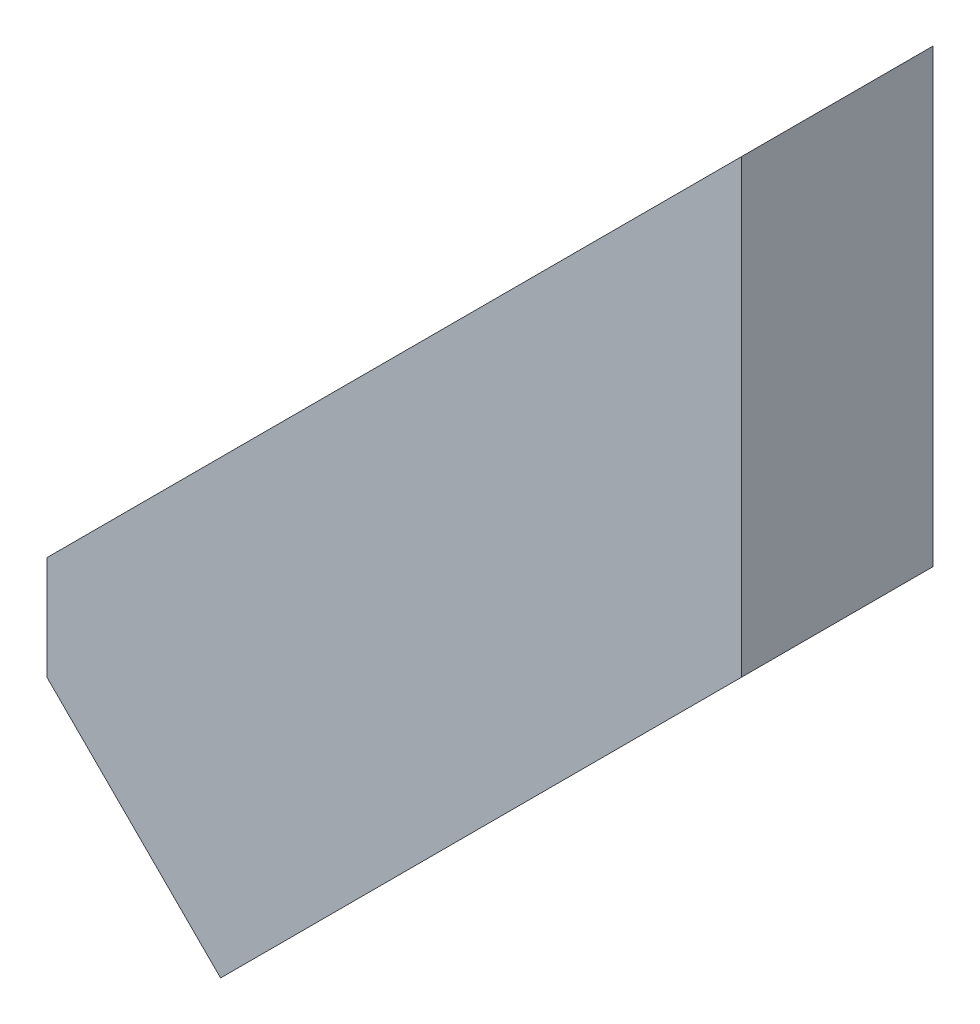
ISO-10303-21;
HEADER;
FILE_DESCRIPTION(('STEP AP214'),'2;1');
FILE_NAME('part.step','',(''),(''),'','','');
FILE_SCHEMA(('AUTOMOTIVE_DESIGN { 1 0 10303 214 1 1 1 1 }'));
ENDSEC;
DATA;
#1=APPLICATION_CONTEXT('core data for automotive mechanical design processes');
#2=APPLICATION_PROTOCOL_DEFINITION('international standard','automotive_design',2000,#1);
#3=PRODUCT_CONTEXT('',#1,'mechanical');
#4=PRODUCT('Part','Part','',(#3));
#5=PRODUCT_RELATED_PRODUCT_CATEGORY('part','',(#4));
#6=PRODUCT_DEFINITION_FORMATION('','',#4);
#7=PRODUCT_DEFINITION_CONTEXT('part definition',#1,'design');
#8=PRODUCT_DEFINITION('design','',#6,#7);
#9=PRODUCT_DEFINITION_SHAPE('','',#8);
#10=(LENGTH_UNIT() NAMED_UNIT(*) SI_UNIT(.MILLI.,.METRE.));
#11=(NAMED_UNIT(*) PLANE_ANGLE_UNIT() SI_UNIT($,.RADIAN.));
#12=(NAMED_UNIT(*) SI_UNIT($,.STERADIAN.) SOLID_ANGLE_UNIT());
#13=UNCERTAINTY_MEASURE_WITH_UNIT(LENGTH_MEASURE(1.E-05),#10,'distance_accuracy_value','');
#14=(GEOMETRIC_REPRESENTATION_CONTEXT(3) GLOBAL_UNCERTAINTY_ASSIGNED_CONTEXT((#13)) GLOBAL_UNIT_ASSIGNED_CONTEXT((#10,
#11,#12)) REPRESENTATION_CONTEXT('',''));
#15=CARTESIAN_POINT('',(0.,0.,0.));
#16=DIRECTION('',(0.,0.,1.));
#17=DIRECTION('',(1.,0.,0.));
#18=AXIS2_PLACEMENT_3D('',#15,#16,#17);
#19=CARTESIAN_POINT('',(1.27016256,0.12832334,0.));
#20=DIRECTION('',(0.707106781186548,-0.707106781186548,0.));
#21=DIRECTION('',(0.,0.,-1.));
#22=AXIS2_PLACEMENT_3D('',#19,#20,#21);
#23=PLANE('',#22);
#24=DIRECTION('',(0.,0.,1.));
#25=VECTOR('',#24,1.);
#26=CARTESIAN_POINT('',(1.27016256,0.12832334,0.));
#27=LINE('',#26,#25);
#28=CARTESIAN_POINT('',(1.27016256,0.12832334,0.));
#29=VERTEX_POINT('',#28);
#30=CARTESIAN_POINT('',(1.27016256,0.12832334,0.6999986));
#31=VERTEX_POINT('',#30);
#32=EDGE_CURVE('E11',#29,#31,#27,.T.);
#33=ORIENTED_EDGE('',*,*,#32,.T.);
#34=DIRECTION('',(-0.707106781186548,-0.707106781186548,0.));
#35=VECTOR('',#34,1.);
#36=CARTESIAN_POINT('',(1.27016256,0.12832334,0.6999986));
#37=LINE('',#36,#35);
#38=CARTESIAN_POINT('',(-0.63516002,-1.77699924,0.6999986));
#39=VERTEX_POINT('',#38);
#40=EDGE_CURVE('E27',#31,#39,#37,.T.);
#41=ORIENTED_EDGE('',*,*,#40,.T.);
#42=DIRECTION('',(0.,0.,1.));
#43=VECTOR('',#42,1.);
#44=CARTESIAN_POINT('',(-0.63516002,-1.77699924,0.));
#45=LINE('',#44,#43);
#46=CARTESIAN_POINT('',(-0.63516002,-1.77699924,0.));
#47=VERTEX_POINT('',#46);
#48=EDGE_CURVE('E51',#47,#39,#45,.T.);
#49=ORIENTED_EDGE('',*,*,#48,.F.);
#50=DIRECTION('',(-0.707106781186548,-0.707106781186548,0.));
#51=VECTOR('',#50,1.);
#52=CARTESIAN_POINT('',(1.27016256,0.12832334,0.));
#53=LINE('',#52,#51);
#54=EDGE_CURVE('E103',#29,#47,#53,.T.);
#55=ORIENTED_EDGE('',*,*,#54,.F.);
#56=EDGE_LOOP('',(#33,#41,#49,#55));
#57=FACE_BOUND('',#56,.T.);
#58=ADVANCED_FACE('F17',(#57),#23,.T.);
#59=CARTESIAN_POINT('',(-0.63516002,-1.77699924,0.));
#60=DIRECTION('',(-0.707106781186548,-0.707106781186548,0.));
#61=DIRECTION('',(-0.707106781186548,0.707106781186548,0.));
#62=AXIS2_PLACEMENT_3D('',#59,#60,#61);
#63=PLANE('',#62);
#64=ORIENTED_EDGE('',*,*,#48,.T.);
#65=DIRECTION('',(-0.707106781186548,0.707106781186548,0.));
#66=VECTOR('',#65,1.);
#67=CARTESIAN_POINT('',(-0.63516002,-1.77699924,0.6999986));
#68=LINE('',#67,#66);
#69=CARTESIAN_POINT('',(-1.27016002,-1.14199924,0.6999986));
#70=VERTEX_POINT('',#69);
#71=EDGE_CURVE('E119',#39,#70,#68,.T.);
#72=ORIENTED_EDGE('',*,*,#71,.T.);
#73=DIRECTION('',(0.,0.,1.));
#74=VECTOR('',#73,1.);
#75=CARTESIAN_POINT('',(-1.27016002,-1.14199924,0.));
#76=LINE('',#75,#74);
#77=CARTESIAN_POINT('',(-1.27016002,-1.14199924,0.));
#78=VERTEX_POINT('',#77);
#79=EDGE_CURVE('E116',#78,#70,#76,.T.);
#80=ORIENTED_EDGE('',*,*,#79,.F.);
#81=DIRECTION('',(-0.707106781186548,0.707106781186548,0.));
#82=VECTOR('',#81,1.);
#83=CARTESIAN_POINT('',(-0.63516002,-1.77699924,0.));
#84=LINE('',#83,#82);
#85=EDGE_CURVE('E109',#47,#78,#84,.T.);
#86=ORIENTED_EDGE('',*,*,#85,.F.);
#87=EDGE_LOOP('',(#64,#72,#80,#86));
#88=FACE_BOUND('',#87,.T.);
#89=ADVANCED_FACE('F141',(#88),#63,.T.);
#90=CARTESIAN_POINT('',(-1.27016002,-1.14199924,0.));
#91=DIRECTION('',(-1.,0.,0.));
#92=DIRECTION('',(0.,0.,1.));
#93=AXIS2_PLACEMENT_3D('',#90,#91,#92);
#94=PLANE('',#93);
#95=ORIENTED_EDGE('',*,*,#79,.T.);
#96=DIRECTION('',(0.,1.,0.));
#97=VECTOR('',#96,1.);
#98=CARTESIAN_POINT('',(-1.27016002,-1.14199924,0.6999986));
#99=LINE('',#98,#97);
#100=CARTESIAN_POINT('',(-1.27016002,-0.7633208,0.6999986));
#101=VERTEX_POINT('',#100);
#102=EDGE_CURVE('E113',#70,#101,#99,.T.);
#103=ORIENTED_EDGE('',*,*,#102,.T.);
#104=DIRECTION('',(0.,0.,1.));
#105=VECTOR('',#104,1.);
#106=CARTESIAN_POINT('',(-1.27016002,-0.7633208,0.));
#107=LINE('',#106,#105);
#108=CARTESIAN_POINT('',(-1.27016002,-0.7633208,0.));
#109=VERTEX_POINT('',#108);
#110=EDGE_CURVE('E21',#109,#101,#107,.T.);
#111=ORIENTED_EDGE('',*,*,#110,.F.);
#112=DIRECTION('',(0.,1.,0.));
#113=VECTOR('',#112,1.);
#114=CARTESIAN_POINT('',(-1.27016002,-1.14199924,0.));
#115=LINE('',#114,#113);
#116=EDGE_CURVE('E115',#78,#109,#115,.T.);
#117=ORIENTED_EDGE('',*,*,#116,.F.);
#118=EDGE_LOOP('',(#95,#103,#111,#117));
#119=FACE_BOUND('',#118,.T.);
#120=ADVANCED_FACE('F144',(#119),#94,.T.);
#121=CARTESIAN_POINT('',(-1.27016002,-0.7633208,0.));
#122=DIRECTION('',(-0.707106781186548,0.707106781186548,0.));
#123=DIRECTION('',(0.,0.,1.));
#124=AXIS2_PLACEMENT_3D('',#121,#122,#123);
#125=PLANE('',#124);
#126=ORIENTED_EDGE('',*,*,#110,.T.);
#127=DIRECTION('',(0.707106781186548,0.707106781186548,0.));
#128=VECTOR('',#127,1.);
#129=CARTESIAN_POINT('',(-1.27016002,-0.7633208,0.6999986));
#130=LINE('',#129,#128);
#131=CARTESIAN_POINT('',(1.27016256,1.77700178,0.6999986));
#132=VERTEX_POINT('',#131);
#133=EDGE_CURVE('E91',#101,#132,#130,.T.);
#134=ORIENTED_EDGE('',*,*,#133,.T.);
#135=DIRECTION('',(0.,0.,1.));
#136=VECTOR('',#135,1.);
#137=CARTESIAN_POINT('',(1.27016256,1.77700178,0.));
#138=LINE('',#137,#136);
#139=CARTESIAN_POINT('',(1.27016256,1.77700178,0.));
#140=VERTEX_POINT('',#139);
#141=EDGE_CURVE('E81',#140,#132,#138,.T.);
#142=ORIENTED_EDGE('',*,*,#141,.F.);
#143=DIRECTION('',(0.707106781186548,0.707106781186548,0.));
#144=VECTOR('',#143,1.);
#145=CARTESIAN_POINT('',(-1.27016002,-0.7633208,0.));
#146=LINE('',#145,#144);
#147=EDGE_CURVE('E121',#109,#140,#146,.T.);
#148=ORIENTED_EDGE('',*,*,#147,.F.);
#149=EDGE_LOOP('',(#126,#134,#142,#148));
#150=FACE_BOUND('',#149,.T.);
#151=ADVANCED_FACE('F95',(#150),#125,.T.);
#152=CARTESIAN_POINT('',(1.27016256,1.77700178,0.));
#153=DIRECTION('',(1.,0.,0.));
#154=DIRECTION('',(0.,1.,0.));
#155=AXIS2_PLACEMENT_3D('',#152,#153,#154);
#156=PLANE('',#155);
#157=ORIENTED_EDGE('',*,*,#141,.T.);
#158=DIRECTION('',(0.,-1.,0.));
#159=VECTOR('',#158,1.);
#160=CARTESIAN_POINT('',(1.27016256,1.77700178,0.6999986));
#161=LINE('',#160,#159);
#162=EDGE_CURVE('E85',#132,#31,#161,.T.);
#163=ORIENTED_EDGE('',*,*,#162,.T.);
#164=ORIENTED_EDGE('',*,*,#32,.F.);
#165=DIRECTION('',(0.,-1.,0.));
#166=VECTOR('',#165,1.);
#167=CARTESIAN_POINT('',(1.27016256,1.77700178,0.));
#168=LINE('',#167,#166);
#169=EDGE_CURVE('E87',#140,#29,#168,.T.);
#170=ORIENTED_EDGE('',*,*,#169,.F.);
#171=EDGE_LOOP('',(#157,#163,#164,#170));
#172=FACE_BOUND('',#171,.T.);
#173=ADVANCED_FACE('F83',(#172),#156,.T.);
#174=CARTESIAN_POINT('',(1.27016256,0.12832334,0.));
#175=DIRECTION('',(0.,0.,1.));
#176=DIRECTION('',(1.,0.,0.));
#177=AXIS2_PLACEMENT_3D('',#174,#175,#176);
#178=PLANE('',#177);
#179=ORIENTED_EDGE('',*,*,#54,.T.);
#180=ORIENTED_EDGE('',*,*,#85,.T.);
#181=ORIENTED_EDGE('',*,*,#116,.T.);
#182=ORIENTED_EDGE('',*,*,#147,.T.);
#183=ORIENTED_EDGE('',*,*,#169,.T.);
#184=EDGE_LOOP('',(#179,#180,#181,#182,#183));
#185=FACE_BOUND('',#184,.T.);
#186=ADVANCED_FACE('F19',(#185),#178,.F.);
#187=CARTESIAN_POINT('',(1.27016256,0.12832334,0.6999986));
#188=DIRECTION('',(0.,0.,1.));
#189=DIRECTION('',(1.,0.,0.));
#190=AXIS2_PLACEMENT_3D('',#187,#188,#189);
#191=PLANE('',#190);
#192=ORIENTED_EDGE('',*,*,#162,.F.);
#193=ORIENTED_EDGE('',*,*,#133,.F.);
#194=ORIENTED_EDGE('',*,*,#102,.F.);
#195=ORIENTED_EDGE('',*,*,#71,.F.);
#196=ORIENTED_EDGE('',*,*,#40,.F.);
#197=EDGE_LOOP('',(#192,#193,#194,#195,#196));
#198=FACE_BOUND('',#197,.T.);
#199=ADVANCED_FACE('F101',(#198),#191,.T.);
#200=CLOSED_SHELL('',(#58,#89,#120,#151,#173,#186,#199));
#201=MANIFOLD_SOLID_BREP('B1',#200);
#202=ADVANCED_BREP_SHAPE_REPRESENTATION('',(#18,#201),#14);
#203=SHAPE_DEFINITION_REPRESENTATION(#9,#202);
ENDSEC;
END-ISO-10303-21;
